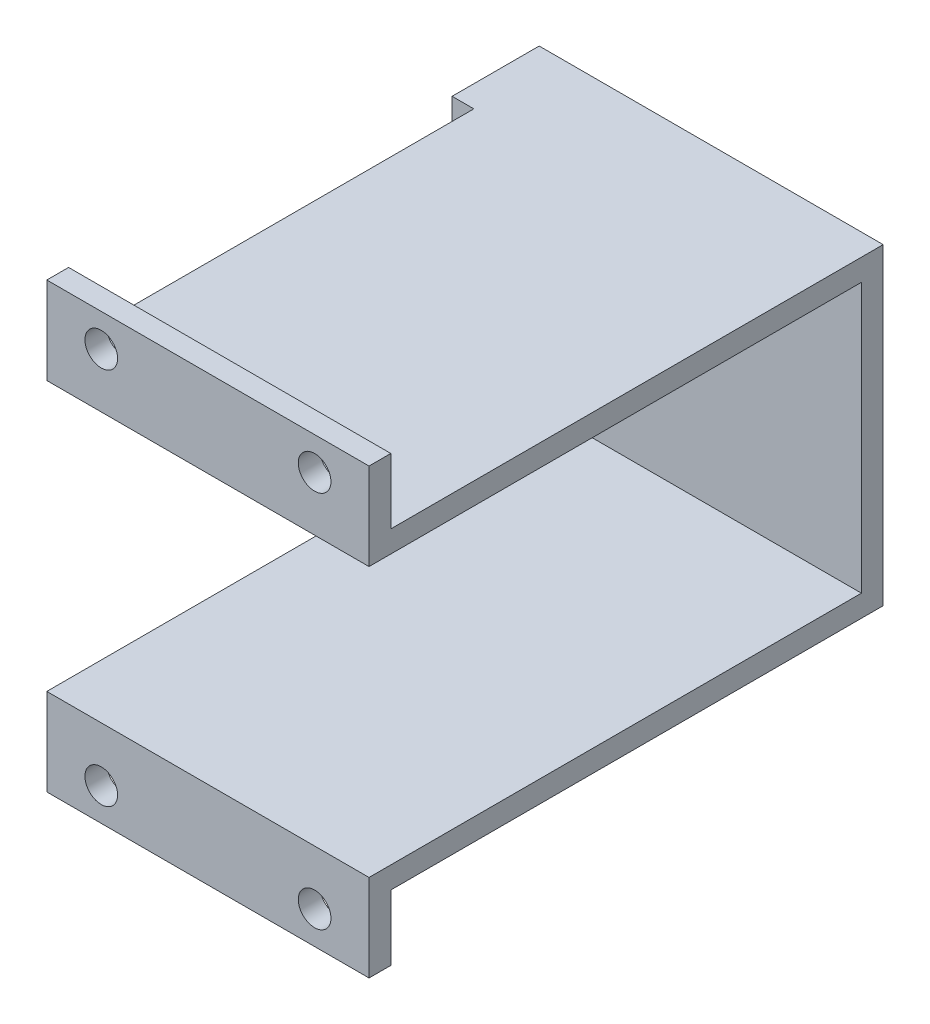
ISO-10303-21;
HEADER;
FILE_DESCRIPTION(('STEP AP214'),'2;1');
FILE_NAME('part.step','',(''),(''),'','','');
FILE_SCHEMA(('AUTOMOTIVE_DESIGN { 1 0 10303 214 1 1 1 1 }'));
ENDSEC;
DATA;
#1=APPLICATION_CONTEXT('core data for automotive mechanical design processes');
#2=APPLICATION_PROTOCOL_DEFINITION('international standard','automotive_design',2000,#1);
#3=PRODUCT_CONTEXT('',#1,'mechanical');
#4=PRODUCT('Part','Part','',(#3));
#5=PRODUCT_RELATED_PRODUCT_CATEGORY('part','',(#4));
#6=PRODUCT_DEFINITION_FORMATION('','',#4);
#7=PRODUCT_DEFINITION_CONTEXT('part definition',#1,'design');
#8=PRODUCT_DEFINITION('design','',#6,#7);
#9=PRODUCT_DEFINITION_SHAPE('','',#8);
#10=(LENGTH_UNIT() NAMED_UNIT(*) SI_UNIT(.MILLI.,.METRE.));
#11=(NAMED_UNIT(*) PLANE_ANGLE_UNIT() SI_UNIT($,.RADIAN.));
#12=(NAMED_UNIT(*) SI_UNIT($,.STERADIAN.) SOLID_ANGLE_UNIT());
#13=UNCERTAINTY_MEASURE_WITH_UNIT(LENGTH_MEASURE(1.E-05),#10,'distance_accuracy_value','');
#14=(GEOMETRIC_REPRESENTATION_CONTEXT(3) GLOBAL_UNCERTAINTY_ASSIGNED_CONTEXT((#13)) GLOBAL_UNIT_ASSIGNED_CONTEXT((#10,
#11,#12)) REPRESENTATION_CONTEXT('',''));
#15=CARTESIAN_POINT('',(0.,0.,0.));
#16=DIRECTION('',(0.,0.,1.));
#17=DIRECTION('',(1.,0.,0.));
#18=AXIS2_PLACEMENT_3D('',#15,#16,#17);
#19=CARTESIAN_POINT('',(-14.8,-14.365,47.23));
#20=DIRECTION('',(0.,1.,0.));
#21=DIRECTION('',(0.,0.,1.));
#22=AXIS2_PLACEMENT_3D('',#19,#20,#21);
#23=PLANE('',#22);
#24=DIRECTION('',(1.,0.,0.));
#25=VECTOR('',#24,1.);
#26=CARTESIAN_POINT('',(-14.8,-14.365,45.23));
#27=LINE('',#26,#25);
#28=CARTESIAN_POINT('',(-14.8,-14.365,45.23));
#29=VERTEX_POINT('',#28);
#30=CARTESIAN_POINT('',(14.8,-14.365,45.23));
#31=VERTEX_POINT('',#30);
#32=EDGE_CURVE('E55',#29,#31,#27,.T.);
#33=ORIENTED_EDGE('',*,*,#32,.F.);
#34=DIRECTION('',(0.,0.,-1.));
#35=VECTOR('',#34,1.);
#36=CARTESIAN_POINT('',(-14.8,-14.365,47.23));
#37=LINE('',#36,#35);
#38=CARTESIAN_POINT('',(-14.8,-14.365,8.));
#39=VERTEX_POINT('',#38);
#40=EDGE_CURVE('E171',#29,#39,#37,.T.);
#41=ORIENTED_EDGE('',*,*,#40,.T.);
#42=DIRECTION('',(1.,0.,0.));
#43=VECTOR('',#42,1.);
#44=CARTESIAN_POINT('',(-16.8,-14.365,8.));
#45=LINE('',#44,#43);
#46=CARTESIAN_POINT('',(-16.8,-14.365,8.));
#47=VERTEX_POINT('',#46);
#48=EDGE_CURVE('E226',#47,#39,#45,.T.);
#49=ORIENTED_EDGE('',*,*,#48,.F.);
#50=DIRECTION('',(0.,0.,1.));
#51=VECTOR('',#50,1.);
#52=CARTESIAN_POINT('',(-16.8,-14.365,0.));
#53=LINE('',#52,#51);
#54=CARTESIAN_POINT('',(-16.8,-14.365,0.));
#55=VERTEX_POINT('',#54);
#56=EDGE_CURVE('E215',#55,#47,#53,.T.);
#57=ORIENTED_EDGE('',*,*,#56,.F.);
#58=DIRECTION('',(1.,0.,0.));
#59=VECTOR('',#58,1.);
#60=CARTESIAN_POINT('',(-14.8,-14.365,0.));
#61=LINE('',#60,#59);
#62=CARTESIAN_POINT('',(14.8,-14.365,0.));
#63=VERTEX_POINT('',#62);
#64=EDGE_CURVE('E272',#55,#63,#61,.T.);
#65=ORIENTED_EDGE('',*,*,#64,.T.);
#66=DIRECTION('',(0.,0.,-1.));
#67=VECTOR('',#66,1.);
#68=CARTESIAN_POINT('',(14.8,-14.365,47.23));
#69=LINE('',#68,#67);
#70=EDGE_CURVE('E267',#31,#63,#69,.T.);
#71=ORIENTED_EDGE('',*,*,#70,.F.);
#72=EDGE_LOOP('',(#33,#41,#49,#57,#65,#71));
#73=FACE_BOUND('',#72,.T.);
#74=ADVANCED_FACE('F37',(#73),#23,.F.);
#75=CARTESIAN_POINT('',(-14.8,-14.365,47.23));
#76=DIRECTION('',(1.,0.,0.));
#77=DIRECTION('',(0.,0.,-1.));
#78=AXIS2_PLACEMENT_3D('',#75,#76,#77);
#79=PLANE('',#78);
#80=DIRECTION('',(0.,1.,0.));
#81=VECTOR('',#80,1.);
#82=CARTESIAN_POINT('',(-14.8,14.365,8.));
#83=LINE('',#82,#81);
#84=CARTESIAN_POINT('',(-14.8,-12.365,8.));
#85=VERTEX_POINT('',#84);
#86=EDGE_CURVE('E47',#39,#85,#83,.T.);
#87=ORIENTED_EDGE('',*,*,#86,.F.);
#88=ORIENTED_EDGE('',*,*,#40,.F.);
#89=DIRECTION('',(0.,1.,0.));
#90=VECTOR('',#89,1.);
#91=CARTESIAN_POINT('',(-14.8,-14.365,45.23));
#92=LINE('',#91,#90);
#93=CARTESIAN_POINT('',(-14.8,-20.365,45.23));
#94=VERTEX_POINT('',#93);
#95=EDGE_CURVE('E152',#94,#29,#92,.T.);
#96=ORIENTED_EDGE('',*,*,#95,.F.);
#97=DIRECTION('',(0.,0.,1.));
#98=VECTOR('',#97,1.);
#99=CARTESIAN_POINT('',(-14.8,-20.365,45.23));
#100=LINE('',#99,#98);
#101=CARTESIAN_POINT('',(-14.8,-20.365,47.23));
#102=VERTEX_POINT('',#101);
#103=EDGE_CURVE('E161',#94,#102,#100,.T.);
#104=ORIENTED_EDGE('',*,*,#103,.T.);
#105=DIRECTION('',(0.,-1.,0.));
#106=VECTOR('',#105,1.);
#107=CARTESIAN_POINT('',(-14.8,-14.365,47.23));
#108=LINE('',#107,#106);
#109=CARTESIAN_POINT('',(-14.8,-12.365,47.23));
#110=VERTEX_POINT('',#109);
#111=EDGE_CURVE('E262',#110,#102,#108,.T.);
#112=ORIENTED_EDGE('',*,*,#111,.F.);
#113=DIRECTION('',(0.,0.,1.));
#114=VECTOR('',#113,1.);
#115=CARTESIAN_POINT('',(-14.8,-12.365,2.));
#116=LINE('',#115,#114);
#117=EDGE_CURVE('E242',#85,#110,#116,.T.);
#118=ORIENTED_EDGE('',*,*,#117,.F.);
#119=EDGE_LOOP('',(#87,#88,#96,#104,#112,#118));
#120=FACE_BOUND('',#119,.T.);
#121=ADVANCED_FACE('F170',(#120),#79,.F.);
#122=CARTESIAN_POINT('',(-14.8,12.365,8.));
#123=VERTEX_POINT('',#122);
#124=CARTESIAN_POINT('',(-14.8,14.365,8.));
#125=VERTEX_POINT('',#124);
#126=EDGE_CURVE('E11',#123,#125,#83,.T.);
#127=ORIENTED_EDGE('',*,*,#126,.F.);
#128=DIRECTION('',(0.,0.,1.));
#129=VECTOR('',#128,1.);
#130=CARTESIAN_POINT('',(-14.8,12.365,2.));
#131=LINE('',#130,#129);
#132=CARTESIAN_POINT('',(-14.8,12.365,47.23));
#133=VERTEX_POINT('',#132);
#134=EDGE_CURVE('E250',#123,#133,#131,.T.);
#135=ORIENTED_EDGE('',*,*,#134,.T.);
#136=CARTESIAN_POINT('',(-14.8,20.365,47.23));
#137=VERTEX_POINT('',#136);
#138=EDGE_CURVE('E264',#137,#133,#108,.T.);
#139=ORIENTED_EDGE('',*,*,#138,.F.);
#140=DIRECTION('',(0.,0.,1.));
#141=VECTOR('',#140,1.);
#142=CARTESIAN_POINT('',(-14.8,20.365,45.23));
#143=LINE('',#142,#141);
#144=CARTESIAN_POINT('',(-14.8,20.365,45.23));
#145=VERTEX_POINT('',#144);
#146=EDGE_CURVE('E207',#145,#137,#143,.T.);
#147=ORIENTED_EDGE('',*,*,#146,.F.);
#148=DIRECTION('',(0.,-1.,0.));
#149=VECTOR('',#148,1.);
#150=CARTESIAN_POINT('',(-14.8,14.365,45.23));
#151=LINE('',#150,#149);
#152=CARTESIAN_POINT('',(-14.8,14.365,45.23));
#153=VERTEX_POINT('',#152);
#154=EDGE_CURVE('E195',#145,#153,#151,.T.);
#155=ORIENTED_EDGE('',*,*,#154,.T.);
#156=DIRECTION('',(0.,0.,-1.));
#157=VECTOR('',#156,1.);
#158=CARTESIAN_POINT('',(-14.8,14.365,47.23));
#159=LINE('',#158,#157);
#160=EDGE_CURVE('E276',#153,#125,#159,.T.);
#161=ORIENTED_EDGE('',*,*,#160,.T.);
#162=EDGE_LOOP('',(#127,#135,#139,#147,#155,#161));
#163=FACE_BOUND('',#162,.T.);
#164=ADVANCED_FACE('F301',(#163),#79,.F.);
#165=CARTESIAN_POINT('',(0.,0.,47.23));
#166=DIRECTION('',(0.,0.,-1.));
#167=DIRECTION('',(-1.,0.,0.));
#168=AXIS2_PLACEMENT_3D('',#165,#166,#167);
#169=PLANE('',#168);
#170=CARTESIAN_POINT('',(9.8,17.365,47.23));
#171=DIRECTION('',(0.,0.,-1.));
#172=DIRECTION('',(-1.,0.,0.));
#173=AXIS2_PLACEMENT_3D('',#170,#171,#172);
#174=CIRCLE('',#173,1.5);
#175=CARTESIAN_POINT('',(8.3,17.365,47.23));
#176=VERTEX_POINT('',#175);
#177=EDGE_CURVE('E183',#176,#176,#174,.T.);
#178=ORIENTED_EDGE('',*,*,#177,.T.);
#179=EDGE_LOOP('',(#178));
#180=FACE_BOUND('',#179,.T.);
#181=CARTESIAN_POINT('',(-9.8,17.365,47.23));
#182=DIRECTION('',(0.,0.,-1.));
#183=DIRECTION('',(-1.,0.,0.));
#184=AXIS2_PLACEMENT_3D('',#181,#182,#183);
#185=CIRCLE('',#184,1.5);
#186=CARTESIAN_POINT('',(-11.3,17.365,47.23));
#187=VERTEX_POINT('',#186);
#188=EDGE_CURVE('E190',#187,#187,#185,.T.);
#189=ORIENTED_EDGE('',*,*,#188,.T.);
#190=EDGE_LOOP('',(#189));
#191=FACE_BOUND('',#190,.T.);
#192=ORIENTED_EDGE('',*,*,#138,.T.);
#193=DIRECTION('',(-1.,0.,0.));
#194=VECTOR('',#193,1.);
#195=CARTESIAN_POINT('',(14.8,12.365,47.23));
#196=LINE('',#195,#194);
#197=CARTESIAN_POINT('',(14.8,12.365,47.23));
#198=VERTEX_POINT('',#197);
#199=EDGE_CURVE('E234',#198,#133,#196,.T.);
#200=ORIENTED_EDGE('',*,*,#199,.F.);
#201=DIRECTION('',(0.,1.,0.));
#202=VECTOR('',#201,1.);
#203=CARTESIAN_POINT('',(14.8,-14.365,47.23));
#204=LINE('',#203,#202);
#205=CARTESIAN_POINT('',(14.8,20.365,47.23));
#206=VERTEX_POINT('',#205);
#207=EDGE_CURVE('E263',#198,#206,#204,.T.);
#208=ORIENTED_EDGE('',*,*,#207,.T.);
#209=DIRECTION('',(-1.,0.,0.));
#210=VECTOR('',#209,1.);
#211=CARTESIAN_POINT('',(-14.8,20.365,47.23));
#212=LINE('',#211,#210);
#213=EDGE_CURVE('E186',#206,#137,#212,.T.);
#214=ORIENTED_EDGE('',*,*,#213,.T.);
#215=EDGE_LOOP('',(#192,#200,#208,#214));
#216=FACE_BOUND('',#215,.T.);
#217=ADVANCED_FACE('F316',(#180,#191,#216),#169,.F.);
#218=CARTESIAN_POINT('',(14.8,-14.365,47.23));
#219=DIRECTION('',(-1.,0.,0.));
#220=DIRECTION('',(0.,0.,1.));
#221=AXIS2_PLACEMENT_3D('',#218,#219,#220);
#222=PLANE('',#221);
#223=ORIENTED_EDGE('',*,*,#207,.F.);
#224=DIRECTION('',(0.,0.,1.));
#225=VECTOR('',#224,1.);
#226=CARTESIAN_POINT('',(14.8,12.365,2.));
#227=LINE('',#226,#225);
#228=CARTESIAN_POINT('',(14.8,12.365,2.));
#229=VERTEX_POINT('',#228);
#230=EDGE_CURVE('E251',#229,#198,#227,.T.);
#231=ORIENTED_EDGE('',*,*,#230,.F.);
#232=DIRECTION('',(0.,1.,0.));
#233=VECTOR('',#232,1.);
#234=CARTESIAN_POINT('',(14.8,-12.365,2.));
#235=LINE('',#234,#233);
#236=CARTESIAN_POINT('',(14.8,-12.365,2.));
#237=VERTEX_POINT('',#236);
#238=EDGE_CURVE('E237',#237,#229,#235,.T.);
#239=ORIENTED_EDGE('',*,*,#238,.F.);
#240=DIRECTION('',(0.,0.,1.));
#241=VECTOR('',#240,1.);
#242=CARTESIAN_POINT('',(14.8,-12.365,2.));
#243=LINE('',#242,#241);
#244=CARTESIAN_POINT('',(14.8,-12.365,47.23));
#245=VERTEX_POINT('',#244);
#246=EDGE_CURVE('E253',#237,#245,#243,.T.);
#247=ORIENTED_EDGE('',*,*,#246,.T.);
#248=CARTESIAN_POINT('',(14.8,-20.365,47.23));
#249=VERTEX_POINT('',#248);
#250=EDGE_CURVE('E259',#249,#245,#204,.T.);
#251=ORIENTED_EDGE('',*,*,#250,.F.);
#252=DIRECTION('',(0.,0.,1.));
#253=VECTOR('',#252,1.);
#254=CARTESIAN_POINT('',(14.8,-20.365,45.23));
#255=LINE('',#254,#253);
#256=CARTESIAN_POINT('',(14.8,-20.365,45.23));
#257=VERTEX_POINT('',#256);
#258=EDGE_CURVE('E167',#257,#249,#255,.T.);
#259=ORIENTED_EDGE('',*,*,#258,.F.);
#260=DIRECTION('',(0.,-1.,0.));
#261=VECTOR('',#260,1.);
#262=CARTESIAN_POINT('',(14.8,-14.365,45.23));
#263=LINE('',#262,#261);
#264=EDGE_CURVE('E154',#31,#257,#263,.T.);
#265=ORIENTED_EDGE('',*,*,#264,.F.);
#266=ORIENTED_EDGE('',*,*,#70,.T.);
#267=DIRECTION('',(0.,1.,0.));
#268=VECTOR('',#267,1.);
#269=CARTESIAN_POINT('',(14.8,-14.365,0.));
#270=LINE('',#269,#268);
#271=CARTESIAN_POINT('',(14.8,14.365,0.));
#272=VERTEX_POINT('',#271);
#273=EDGE_CURVE('E249',#63,#272,#270,.T.);
#274=ORIENTED_EDGE('',*,*,#273,.T.);
#275=DIRECTION('',(0.,0.,-1.));
#276=VECTOR('',#275,1.);
#277=CARTESIAN_POINT('',(14.8,14.365,47.23));
#278=LINE('',#277,#276);
#279=CARTESIAN_POINT('',(14.8,14.365,45.23));
#280=VERTEX_POINT('',#279);
#281=EDGE_CURVE('E41',#280,#272,#278,.T.);
#282=ORIENTED_EDGE('',*,*,#281,.F.);
#283=DIRECTION('',(0.,1.,0.));
#284=VECTOR('',#283,1.);
#285=CARTESIAN_POINT('',(14.8,14.365,45.23));
#286=LINE('',#285,#284);
#287=CARTESIAN_POINT('',(14.8,20.365,45.23));
#288=VERTEX_POINT('',#287);
#289=EDGE_CURVE('E63',#280,#288,#286,.T.);
#290=ORIENTED_EDGE('',*,*,#289,.T.);
#291=DIRECTION('',(0.,0.,1.));
#292=VECTOR('',#291,1.);
#293=CARTESIAN_POINT('',(14.8,20.365,45.23));
#294=LINE('',#293,#292);
#295=EDGE_CURVE('E204',#288,#206,#294,.T.);
#296=ORIENTED_EDGE('',*,*,#295,.T.);
#297=EDGE_LOOP('',(#223,#231,#239,#247,#251,#259,#265,#266,#274,#282,#290,#296));
#298=FACE_BOUND('',#297,.T.);
#299=ADVANCED_FACE('F39',(#298),#222,.F.);
#300=CARTESIAN_POINT('',(-14.8,14.365,47.23));
#301=DIRECTION('',(0.,-1.,0.));
#302=DIRECTION('',(0.,0.,-1.));
#303=AXIS2_PLACEMENT_3D('',#300,#301,#302);
#304=PLANE('',#303);
#305=ORIENTED_EDGE('',*,*,#160,.F.);
#306=DIRECTION('',(1.,0.,0.));
#307=VECTOR('',#306,1.);
#308=CARTESIAN_POINT('',(-14.8,14.365,45.23));
#309=LINE('',#308,#307);
#310=EDGE_CURVE('E198',#153,#280,#309,.T.);
#311=ORIENTED_EDGE('',*,*,#310,.T.);
#312=ORIENTED_EDGE('',*,*,#281,.T.);
#313=DIRECTION('',(-1.,0.,0.));
#314=VECTOR('',#313,1.);
#315=CARTESIAN_POINT('',(-14.8,14.365,0.));
#316=LINE('',#315,#314);
#317=CARTESIAN_POINT('',(-16.8,14.365,0.));
#318=VERTEX_POINT('',#317);
#319=EDGE_CURVE('E270',#272,#318,#316,.T.);
#320=ORIENTED_EDGE('',*,*,#319,.T.);
#321=DIRECTION('',(0.,0.,-1.));
#322=VECTOR('',#321,1.);
#323=CARTESIAN_POINT('',(-16.8,14.365,0.));
#324=LINE('',#323,#322);
#325=CARTESIAN_POINT('',(-16.8,14.365,8.));
#326=VERTEX_POINT('',#325);
#327=EDGE_CURVE('E219',#326,#318,#324,.T.);
#328=ORIENTED_EDGE('',*,*,#327,.F.);
#329=DIRECTION('',(1.,0.,0.));
#330=VECTOR('',#329,1.);
#331=CARTESIAN_POINT('',(-16.8,14.365,8.));
#332=LINE('',#331,#330);
#333=EDGE_CURVE('E221',#326,#125,#332,.T.);
#334=ORIENTED_EDGE('',*,*,#333,.T.);
#335=EDGE_LOOP('',(#305,#311,#312,#320,#328,#334));
#336=FACE_BOUND('',#335,.T.);
#337=ADVANCED_FACE('F282',(#336),#304,.F.);
#338=CARTESIAN_POINT('',(9.8,-17.365,47.23));
#339=DIRECTION('',(0.,0.,1.));
#340=DIRECTION('',(-1.,0.,0.));
#341=AXIS2_PLACEMENT_3D('',#338,#339,#340);
#342=CIRCLE('',#341,1.5);
#343=CARTESIAN_POINT('',(8.3,-17.365,47.23));
#344=VERTEX_POINT('',#343);
#345=EDGE_CURVE('E173',#344,#344,#342,.T.);
#346=ORIENTED_EDGE('',*,*,#345,.F.);
#347=EDGE_LOOP('',(#346));
#348=FACE_BOUND('',#347,.T.);
#349=CARTESIAN_POINT('',(-9.8,-17.365,47.23));
#350=DIRECTION('',(0.,0.,1.));
#351=DIRECTION('',(-1.,0.,0.));
#352=AXIS2_PLACEMENT_3D('',#349,#350,#351);
#353=CIRCLE('',#352,1.5);
#354=CARTESIAN_POINT('',(-11.3,-17.365,47.23));
#355=VERTEX_POINT('',#354);
#356=EDGE_CURVE('E480',#355,#355,#353,.T.);
#357=ORIENTED_EDGE('',*,*,#356,.F.);
#358=EDGE_LOOP('',(#357));
#359=FACE_BOUND('',#358,.T.);
#360=ORIENTED_EDGE('',*,*,#250,.T.);
#361=DIRECTION('',(1.,0.,0.));
#362=VECTOR('',#361,1.);
#363=CARTESIAN_POINT('',(14.8,-12.365,47.23));
#364=LINE('',#363,#362);
#365=EDGE_CURVE('E229',#110,#245,#364,.T.);
#366=ORIENTED_EDGE('',*,*,#365,.F.);
#367=ORIENTED_EDGE('',*,*,#111,.T.);
#368=DIRECTION('',(-1.,0.,0.));
#369=VECTOR('',#368,1.);
#370=CARTESIAN_POINT('',(-14.8,-20.365,47.23));
#371=LINE('',#370,#369);
#372=EDGE_CURVE('E164',#249,#102,#371,.T.);
#373=ORIENTED_EDGE('',*,*,#372,.F.);
#374=EDGE_LOOP('',(#360,#366,#367,#373));
#375=FACE_BOUND('',#374,.T.);
#376=ADVANCED_FACE('F344',(#348,#359,#375),#169,.F.);
#377=CARTESIAN_POINT('',(0.,0.,0.));
#378=DIRECTION('',(0.,0.,-1.));
#379=DIRECTION('',(-1.,0.,0.));
#380=AXIS2_PLACEMENT_3D('',#377,#378,#379);
#381=PLANE('',#380);
#382=ORIENTED_EDGE('',*,*,#273,.F.);
#383=ORIENTED_EDGE('',*,*,#64,.F.);
#384=DIRECTION('',(0.,-1.,0.));
#385=VECTOR('',#384,1.);
#386=CARTESIAN_POINT('',(-16.8,14.365,0.));
#387=LINE('',#386,#385);
#388=EDGE_CURVE('E212',#318,#55,#387,.T.);
#389=ORIENTED_EDGE('',*,*,#388,.F.);
#390=ORIENTED_EDGE('',*,*,#319,.F.);
#391=EDGE_LOOP('',(#382,#383,#389,#390));
#392=FACE_BOUND('',#391,.T.);
#393=ADVANCED_FACE('F288',(#392),#381,.T.);
#394=CARTESIAN_POINT('',(14.8,12.365,2.));
#395=DIRECTION('',(0.,1.,0.));
#396=DIRECTION('',(0.,0.,1.));
#397=AXIS2_PLACEMENT_3D('',#394,#395,#396);
#398=PLANE('',#397);
#399=ORIENTED_EDGE('',*,*,#199,.T.);
#400=ORIENTED_EDGE('',*,*,#134,.F.);
#401=CARTESIAN_POINT('',(-14.8,12.365,2.));
#402=VERTEX_POINT('',#401);
#403=EDGE_CURVE('E246',#402,#123,#131,.T.);
#404=ORIENTED_EDGE('',*,*,#403,.F.);
#405=DIRECTION('',(-1.,0.,0.));
#406=VECTOR('',#405,1.);
#407=CARTESIAN_POINT('',(14.8,12.365,2.));
#408=LINE('',#407,#406);
#409=EDGE_CURVE('E239',#229,#402,#408,.T.);
#410=ORIENTED_EDGE('',*,*,#409,.F.);
#411=ORIENTED_EDGE('',*,*,#230,.T.);
#412=EDGE_LOOP('',(#399,#400,#404,#410,#411));
#413=FACE_BOUND('',#412,.T.);
#414=ADVANCED_FACE('F303',(#413),#398,.F.);
#415=CARTESIAN_POINT('',(14.8,-12.365,2.));
#416=DIRECTION('',(0.,-1.,0.));
#417=DIRECTION('',(0.,0.,-1.));
#418=AXIS2_PLACEMENT_3D('',#415,#416,#417);
#419=PLANE('',#418);
#420=ORIENTED_EDGE('',*,*,#365,.T.);
#421=ORIENTED_EDGE('',*,*,#246,.F.);
#422=DIRECTION('',(1.,0.,0.));
#423=VECTOR('',#422,1.);
#424=CARTESIAN_POINT('',(14.8,-12.365,2.));
#425=LINE('',#424,#423);
#426=CARTESIAN_POINT('',(-14.8,-12.365,2.));
#427=VERTEX_POINT('',#426);
#428=EDGE_CURVE('E233',#427,#237,#425,.T.);
#429=ORIENTED_EDGE('',*,*,#428,.F.);
#430=EDGE_CURVE('E256',#427,#85,#116,.T.);
#431=ORIENTED_EDGE('',*,*,#430,.T.);
#432=ORIENTED_EDGE('',*,*,#117,.T.);
#433=EDGE_LOOP('',(#420,#421,#429,#431,#432));
#434=FACE_BOUND('',#433,.T.);
#435=ADVANCED_FACE('F359',(#434),#419,.F.);
#436=CARTESIAN_POINT('',(0.,0.,2.));
#437=DIRECTION('',(0.,0.,1.));
#438=DIRECTION('',(1.,0.,0.));
#439=AXIS2_PLACEMENT_3D('',#436,#437,#438);
#440=PLANE('',#439);
#441=DIRECTION('',(0.,-1.,0.));
#442=VECTOR('',#441,1.);
#443=CARTESIAN_POINT('',(-14.8,-12.365,2.));
#444=LINE('',#443,#442);
#445=EDGE_CURVE('E230',#402,#427,#444,.T.);
#446=ORIENTED_EDGE('',*,*,#445,.T.);
#447=ORIENTED_EDGE('',*,*,#428,.T.);
#448=ORIENTED_EDGE('',*,*,#238,.T.);
#449=ORIENTED_EDGE('',*,*,#409,.T.);
#450=EDGE_LOOP('',(#446,#447,#448,#449));
#451=FACE_BOUND('',#450,.T.);
#452=ADVANCED_FACE('F311',(#451),#440,.T.);
#453=CARTESIAN_POINT('',(-14.8,0.,0.));
#454=DIRECTION('',(-1.,0.,0.));
#455=DIRECTION('',(0.,0.,1.));
#456=AXIS2_PLACEMENT_3D('',#453,#454,#455);
#457=PLANE('',#456);
#458=ORIENTED_EDGE('',*,*,#445,.F.);
#459=ORIENTED_EDGE('',*,*,#403,.T.);
#460=EDGE_CURVE('E48',#85,#123,#83,.T.);
#461=ORIENTED_EDGE('',*,*,#460,.F.);
#462=ORIENTED_EDGE('',*,*,#430,.F.);
#463=EDGE_LOOP('',(#458,#459,#461,#462));
#464=FACE_BOUND('',#463,.T.);
#465=ADVANCED_FACE('F308',(#464),#457,.F.);
#466=CARTESIAN_POINT('',(-16.8,14.365,8.));
#467=DIRECTION('',(0.,0.,-1.));
#468=DIRECTION('',(0.,1.,0.));
#469=AXIS2_PLACEMENT_3D('',#466,#467,#468);
#470=PLANE('',#469);
#471=ORIENTED_EDGE('',*,*,#86,.T.);
#472=ORIENTED_EDGE('',*,*,#460,.T.);
#473=ORIENTED_EDGE('',*,*,#126,.T.);
#474=ORIENTED_EDGE('',*,*,#333,.F.);
#475=DIRECTION('',(0.,1.,0.));
#476=VECTOR('',#475,1.);
#477=CARTESIAN_POINT('',(-16.8,14.365,8.));
#478=LINE('',#477,#476);
#479=EDGE_CURVE('E217',#47,#326,#478,.T.);
#480=ORIENTED_EDGE('',*,*,#479,.F.);
#481=ORIENTED_EDGE('',*,*,#48,.T.);
#482=EDGE_LOOP('',(#471,#472,#473,#474,#480,#481));
#483=FACE_BOUND('',#482,.T.);
#484=ADVANCED_FACE('F297',(#483),#470,.F.);
#485=CARTESIAN_POINT('',(-16.8,0.,0.));
#486=DIRECTION('',(-1.,0.,0.));
#487=DIRECTION('',(0.,0.,1.));
#488=AXIS2_PLACEMENT_3D('',#485,#486,#487);
#489=PLANE('',#488);
#490=ORIENTED_EDGE('',*,*,#388,.T.);
#491=ORIENTED_EDGE('',*,*,#56,.T.);
#492=ORIENTED_EDGE('',*,*,#479,.T.);
#493=ORIENTED_EDGE('',*,*,#327,.T.);
#494=EDGE_LOOP('',(#490,#491,#492,#493));
#495=FACE_BOUND('',#494,.T.);
#496=ADVANCED_FACE('F294',(#495),#489,.T.);
#497=CARTESIAN_POINT('',(-14.8,20.365,45.23));
#498=DIRECTION('',(0.,1.,0.));
#499=DIRECTION('',(0.,0.,1.));
#500=AXIS2_PLACEMENT_3D('',#497,#498,#499);
#501=PLANE('',#500);
#502=ORIENTED_EDGE('',*,*,#213,.F.);
#503=ORIENTED_EDGE('',*,*,#295,.F.);
#504=DIRECTION('',(-1.,0.,0.));
#505=VECTOR('',#504,1.);
#506=CARTESIAN_POINT('',(-14.8,20.365,45.23));
#507=LINE('',#506,#505);
#508=EDGE_CURVE('E201',#288,#145,#507,.T.);
#509=ORIENTED_EDGE('',*,*,#508,.T.);
#510=ORIENTED_EDGE('',*,*,#146,.T.);
#511=EDGE_LOOP('',(#502,#503,#509,#510));
#512=FACE_BOUND('',#511,.T.);
#513=ADVANCED_FACE('F319',(#512),#501,.T.);
#514=CARTESIAN_POINT('',(0.,0.,45.23));
#515=DIRECTION('',(0.,0.,-1.));
#516=DIRECTION('',(-1.,0.,0.));
#517=AXIS2_PLACEMENT_3D('',#514,#515,#516);
#518=PLANE('',#517);
#519=CARTESIAN_POINT('',(9.8,17.365,45.23));
#520=DIRECTION('',(0.,0.,-1.));
#521=DIRECTION('',(-1.,0.,0.));
#522=AXIS2_PLACEMENT_3D('',#519,#520,#521);
#523=CIRCLE('',#522,1.5);
#524=CARTESIAN_POINT('',(8.3,17.365,45.23));
#525=VERTEX_POINT('',#524);
#526=EDGE_CURVE('E187',#525,#525,#523,.T.);
#527=ORIENTED_EDGE('',*,*,#526,.F.);
#528=EDGE_LOOP('',(#527));
#529=FACE_BOUND('',#528,.T.);
#530=CARTESIAN_POINT('',(-9.8,17.365,45.23));
#531=DIRECTION('',(0.,0.,-1.));
#532=DIRECTION('',(-1.,0.,0.));
#533=AXIS2_PLACEMENT_3D('',#530,#531,#532);
#534=CIRCLE('',#533,1.5);
#535=CARTESIAN_POINT('',(-11.3,17.365,45.23));
#536=VERTEX_POINT('',#535);
#537=EDGE_CURVE('E181',#536,#536,#534,.T.);
#538=ORIENTED_EDGE('',*,*,#537,.F.);
#539=EDGE_LOOP('',(#538));
#540=FACE_BOUND('',#539,.T.);
#541=ORIENTED_EDGE('',*,*,#154,.F.);
#542=ORIENTED_EDGE('',*,*,#508,.F.);
#543=ORIENTED_EDGE('',*,*,#289,.F.);
#544=ORIENTED_EDGE('',*,*,#310,.F.);
#545=EDGE_LOOP('',(#541,#542,#543,#544));
#546=FACE_BOUND('',#545,.T.);
#547=ADVANCED_FACE('F320',(#529,#540,#546),#518,.T.);
#548=CARTESIAN_POINT('',(-9.8,17.365,47.23));
#549=DIRECTION('',(0.,0.,-1.));
#550=DIRECTION('',(-1.,0.,0.));
#551=AXIS2_PLACEMENT_3D('',#548,#549,#550);
#552=CYLINDRICAL_SURFACE('',#551,1.5);
#553=ORIENTED_EDGE('',*,*,#188,.F.);
#554=EDGE_LOOP('',(#553));
#555=FACE_BOUND('',#554,.T.);
#556=ORIENTED_EDGE('',*,*,#537,.T.);
#557=EDGE_LOOP('',(#556));
#558=FACE_BOUND('',#557,.T.);
#559=ADVANCED_FACE('F322',(#555,#558),#552,.F.);
#560=CARTESIAN_POINT('',(9.8,17.365,47.23));
#561=DIRECTION('',(0.,0.,-1.));
#562=DIRECTION('',(-1.,0.,0.));
#563=AXIS2_PLACEMENT_3D('',#560,#561,#562);
#564=CYLINDRICAL_SURFACE('',#563,1.5);
#565=ORIENTED_EDGE('',*,*,#177,.F.);
#566=EDGE_LOOP('',(#565));
#567=FACE_BOUND('',#566,.T.);
#568=ORIENTED_EDGE('',*,*,#526,.T.);
#569=EDGE_LOOP('',(#568));
#570=FACE_BOUND('',#569,.T.);
#571=ADVANCED_FACE('F329',(#567,#570),#564,.F.);
#572=CARTESIAN_POINT('',(-14.8,-20.365,45.23));
#573=DIRECTION('',(0.,1.,0.));
#574=DIRECTION('',(0.,0.,1.));
#575=AXIS2_PLACEMENT_3D('',#572,#573,#574);
#576=PLANE('',#575);
#577=ORIENTED_EDGE('',*,*,#372,.T.);
#578=ORIENTED_EDGE('',*,*,#103,.F.);
#579=DIRECTION('',(-1.,0.,0.));
#580=VECTOR('',#579,1.);
#581=CARTESIAN_POINT('',(-14.8,-20.365,45.23));
#582=LINE('',#581,#580);
#583=EDGE_CURVE('E148',#257,#94,#582,.T.);
#584=ORIENTED_EDGE('',*,*,#583,.F.);
#585=ORIENTED_EDGE('',*,*,#258,.T.);
#586=EDGE_LOOP('',(#577,#578,#584,#585));
#587=FACE_BOUND('',#586,.T.);
#588=ADVANCED_FACE('F162',(#587),#576,.F.);
#589=CARTESIAN_POINT('',(0.,0.,45.23));
#590=DIRECTION('',(0.,0.,-1.));
#591=DIRECTION('',(-1.,0.,0.));
#592=AXIS2_PLACEMENT_3D('',#589,#590,#591);
#593=PLANE('',#592);
#594=CARTESIAN_POINT('',(9.8,-17.365,45.23));
#595=DIRECTION('',(0.,0.,1.));
#596=DIRECTION('',(-1.,0.,0.));
#597=AXIS2_PLACEMENT_3D('',#594,#595,#596);
#598=CIRCLE('',#597,1.5);
#599=CARTESIAN_POINT('',(8.3,-17.365,45.23));
#600=VERTEX_POINT('',#599);
#601=EDGE_CURVE('E479',#600,#600,#598,.T.);
#602=ORIENTED_EDGE('',*,*,#601,.T.);
#603=EDGE_LOOP('',(#602));
#604=FACE_BOUND('',#603,.T.);
#605=CARTESIAN_POINT('',(-9.8,-17.365,45.23));
#606=DIRECTION('',(0.,0.,1.));
#607=DIRECTION('',(-1.,0.,0.));
#608=AXIS2_PLACEMENT_3D('',#605,#606,#607);
#609=CIRCLE('',#608,1.5);
#610=CARTESIAN_POINT('',(-11.3,-17.365,45.23));
#611=VERTEX_POINT('',#610);
#612=EDGE_CURVE('E176',#611,#611,#609,.T.);
#613=ORIENTED_EDGE('',*,*,#612,.T.);
#614=EDGE_LOOP('',(#613));
#615=FACE_BOUND('',#614,.T.);
#616=ORIENTED_EDGE('',*,*,#95,.T.);
#617=ORIENTED_EDGE('',*,*,#32,.T.);
#618=ORIENTED_EDGE('',*,*,#264,.T.);
#619=ORIENTED_EDGE('',*,*,#583,.T.);
#620=EDGE_LOOP('',(#616,#617,#618,#619));
#621=FACE_BOUND('',#620,.T.);
#622=ADVANCED_FACE('F150',(#604,#615,#621),#593,.T.);
#623=CARTESIAN_POINT('',(-9.8,-17.365,47.23));
#624=DIRECTION('',(0.,0.,-1.));
#625=DIRECTION('',(-1.,0.,0.));
#626=AXIS2_PLACEMENT_3D('',#623,#624,#625);
#627=CYLINDRICAL_SURFACE('',#626,1.5);
#628=ORIENTED_EDGE('',*,*,#356,.T.);
#629=EDGE_LOOP('',(#628));
#630=FACE_BOUND('',#629,.T.);
#631=ORIENTED_EDGE('',*,*,#612,.F.);
#632=EDGE_LOOP('',(#631));
#633=FACE_BOUND('',#632,.T.);
#634=ADVANCED_FACE('F450',(#630,#633),#627,.F.);
#635=CARTESIAN_POINT('',(9.8,-17.365,47.23));
#636=DIRECTION('',(0.,0.,-1.));
#637=DIRECTION('',(-1.,0.,0.));
#638=AXIS2_PLACEMENT_3D('',#635,#636,#637);
#639=CYLINDRICAL_SURFACE('',#638,1.5);
#640=ORIENTED_EDGE('',*,*,#345,.T.);
#641=EDGE_LOOP('',(#640));
#642=FACE_BOUND('',#641,.T.);
#643=ORIENTED_EDGE('',*,*,#601,.F.);
#644=EDGE_LOOP('',(#643));
#645=FACE_BOUND('',#644,.T.);
#646=ADVANCED_FACE('F460',(#642,#645),#639,.F.);
#647=CLOSED_SHELL('',(#74,#121,#164,#217,#299,#337,#376,#393,#414,#435,#452,#465,#484,#496,#513,
#547,#559,#571,#588,#622,#634,#646));
#648=MANIFOLD_SOLID_BREP('B2',#647);
#649=ADVANCED_BREP_SHAPE_REPRESENTATION('',(#18,#648),#14);
#650=SHAPE_DEFINITION_REPRESENTATION(#9,#649);
ENDSEC;
END-ISO-10303-21;
